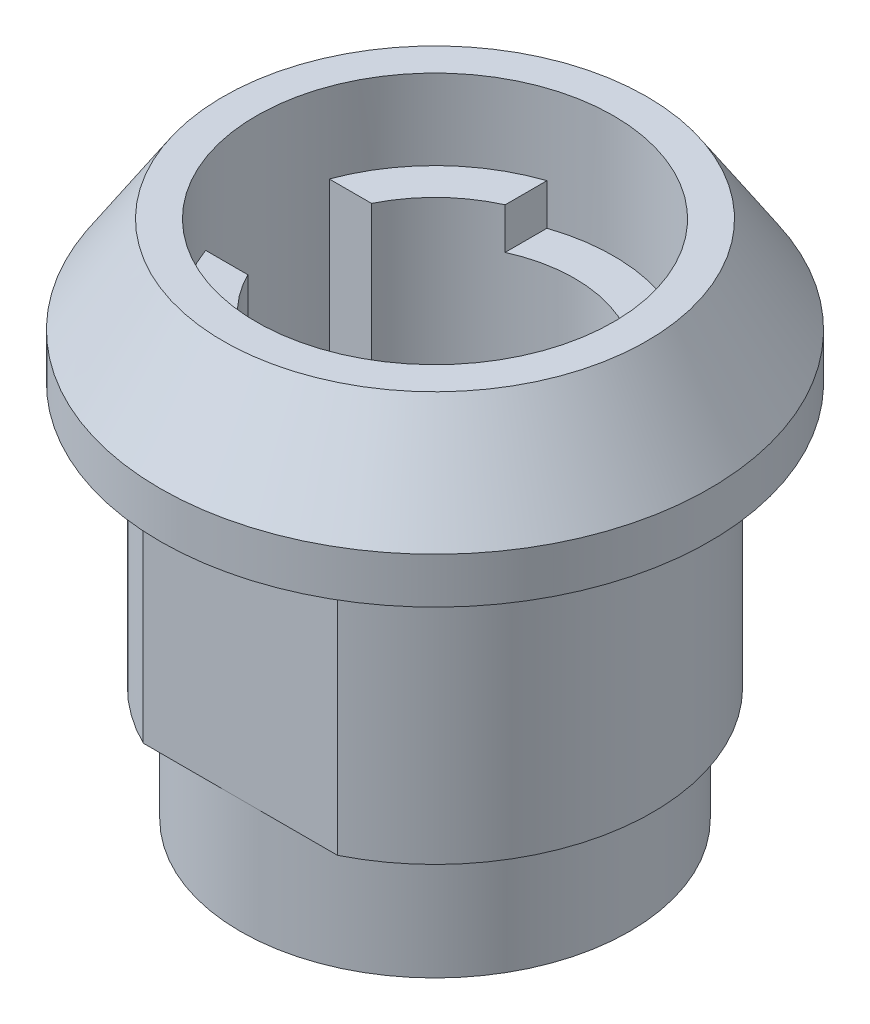
ISO-10303-21;
HEADER;
FILE_DESCRIPTION(('STEP AP214'),'2;1');
FILE_NAME('part.step','',(''),(''),'','','');
FILE_SCHEMA(('AUTOMOTIVE_DESIGN { 1 0 10303 214 1 1 1 1 }'));
ENDSEC;
DATA;
#1=APPLICATION_CONTEXT('core data for automotive mechanical design processes');
#2=APPLICATION_PROTOCOL_DEFINITION('international standard','automotive_design',2000,#1);
#3=PRODUCT_CONTEXT('',#1,'mechanical');
#4=PRODUCT('Part','Part','',(#3));
#5=PRODUCT_RELATED_PRODUCT_CATEGORY('part','',(#4));
#6=PRODUCT_DEFINITION_FORMATION('','',#4);
#7=PRODUCT_DEFINITION_CONTEXT('part definition',#1,'design');
#8=PRODUCT_DEFINITION('design','',#6,#7);
#9=PRODUCT_DEFINITION_SHAPE('','',#8);
#10=(LENGTH_UNIT() NAMED_UNIT(*) SI_UNIT(.MILLI.,.METRE.));
#11=(NAMED_UNIT(*) PLANE_ANGLE_UNIT() SI_UNIT($,.RADIAN.));
#12=(NAMED_UNIT(*) SI_UNIT($,.STERADIAN.) SOLID_ANGLE_UNIT());
#13=UNCERTAINTY_MEASURE_WITH_UNIT(LENGTH_MEASURE(1.E-05),#10,'distance_accuracy_value','');
#14=(GEOMETRIC_REPRESENTATION_CONTEXT(3) GLOBAL_UNCERTAINTY_ASSIGNED_CONTEXT((#13)) GLOBAL_UNIT_ASSIGNED_CONTEXT((#10,
#11,#12)) REPRESENTATION_CONTEXT('',''));
#15=CARTESIAN_POINT('',(0.,0.,0.));
#16=DIRECTION('',(0.,0.,1.));
#17=DIRECTION('',(1.,0.,0.));
#18=AXIS2_PLACEMENT_3D('',#15,#16,#17);
#19=CARTESIAN_POINT('',(0.,8.7,0.));
#20=DIRECTION('',(0.,1.,0.));
#21=DIRECTION('',(0.,0.,1.));
#22=AXIS2_PLACEMENT_3D('',#19,#20,#21);
#23=CYLINDRICAL_SURFACE('',#22,6.1);
#24=CARTESIAN_POINT('',(0.,17.4,0.));
#25=DIRECTION('',(0.,-1.,0.));
#26=DIRECTION('',(0.,0.,1.));
#27=AXIS2_PLACEMENT_3D('',#24,#25,#26);
#28=CIRCLE('',#27,6.1);
#29=CARTESIAN_POINT('',(-2.5,17.4,-5.56417109729742));
#30=VERTEX_POINT('',#29);
#31=CARTESIAN_POINT('',(5.46991773247094,17.4,-2.7));
#32=VERTEX_POINT('',#31);
#33=EDGE_CURVE('E11',#30,#32,#28,.T.);
#34=ORIENTED_EDGE('',*,*,#33,.F.);
#35=DIRECTION('',(0.,1.,0.));
#36=VECTOR('',#35,1.);
#37=CARTESIAN_POINT('',(-2.5,17.4,-5.56417109729743));
#38=LINE('',#37,#36);
#39=CARTESIAN_POINT('',(-2.5,19.2,-5.56417109729743));
#40=VERTEX_POINT('',#39);
#41=EDGE_CURVE('E307',#30,#40,#38,.T.);
#42=ORIENTED_EDGE('',*,*,#41,.T.);
#43=CARTESIAN_POINT('',(0.,19.2,0.));
#44=DIRECTION('',(0.,-1.,0.));
#45=DIRECTION('',(0.,0.,1.));
#46=AXIS2_PLACEMENT_3D('',#43,#44,#45);
#47=CIRCLE('',#46,6.1);
#48=CARTESIAN_POINT('',(-5.46991773247094,19.2,-2.7));
#49=VERTEX_POINT('',#48);
#50=EDGE_CURVE('E295',#49,#40,#47,.T.);
#51=ORIENTED_EDGE('',*,*,#50,.F.);
#52=DIRECTION('',(0.,1.,0.));
#53=VECTOR('',#52,1.);
#54=CARTESIAN_POINT('',(-5.46991773247094,3.8,-2.7));
#55=LINE('',#54,#53);
#56=CARTESIAN_POINT('',(-5.46991773247094,3.8,-2.7));
#57=VERTEX_POINT('',#56);
#58=EDGE_CURVE('E301',#57,#49,#55,.T.);
#59=ORIENTED_EDGE('',*,*,#58,.F.);
#60=CARTESIAN_POINT('',(0.,3.8,0.));
#61=DIRECTION('',(0.,1.,0.));
#62=DIRECTION('',(0.,0.,1.));
#63=AXIS2_PLACEMENT_3D('',#60,#61,#62);
#64=CIRCLE('',#63,6.1);
#65=CARTESIAN_POINT('',(-5.46991773247094,3.8,2.7));
#66=VERTEX_POINT('',#65);
#67=EDGE_CURVE('E261',#57,#66,#64,.T.);
#68=ORIENTED_EDGE('',*,*,#67,.T.);
#69=DIRECTION('',(0.,1.,0.));
#70=VECTOR('',#69,1.);
#71=CARTESIAN_POINT('',(-5.46991773247094,3.8,2.7));
#72=LINE('',#71,#70);
#73=CARTESIAN_POINT('',(-5.46991773247094,19.2,2.7));
#74=VERTEX_POINT('',#73);
#75=EDGE_CURVE('E240',#66,#74,#72,.T.);
#76=ORIENTED_EDGE('',*,*,#75,.T.);
#77=CARTESIAN_POINT('',(0.,19.2,0.));
#78=DIRECTION('',(0.,1.,0.));
#79=DIRECTION('',(0.,0.,1.));
#80=AXIS2_PLACEMENT_3D('',#77,#78,#79);
#81=CIRCLE('',#80,6.1);
#82=CARTESIAN_POINT('',(-2.5,19.2,5.56417109729743));
#83=VERTEX_POINT('',#82);
#84=EDGE_CURVE('E274',#74,#83,#81,.T.);
#85=ORIENTED_EDGE('',*,*,#84,.T.);
#86=DIRECTION('',(0.,1.,0.));
#87=VECTOR('',#86,1.);
#88=CARTESIAN_POINT('',(-2.5,17.4,5.56417109729743));
#89=LINE('',#88,#87);
#90=CARTESIAN_POINT('',(-2.5,17.4,5.56417109729743));
#91=VERTEX_POINT('',#90);
#92=EDGE_CURVE('E272',#91,#83,#89,.T.);
#93=ORIENTED_EDGE('',*,*,#92,.F.);
#94=CARTESIAN_POINT('',(0.,17.4,0.));
#95=DIRECTION('',(0.,-1.,0.));
#96=DIRECTION('',(0.,0.,1.));
#97=AXIS2_PLACEMENT_3D('',#94,#95,#96);
#98=CIRCLE('',#97,6.1);
#99=CARTESIAN_POINT('',(5.46991773247094,17.4,2.7));
#100=VERTEX_POINT('',#99);
#101=EDGE_CURVE('E248',#100,#91,#98,.T.);
#102=ORIENTED_EDGE('',*,*,#101,.F.);
#103=DIRECTION('',(0.,1.,0.));
#104=VECTOR('',#103,1.);
#105=CARTESIAN_POINT('',(5.46991773247094,3.8,2.7));
#106=LINE('',#105,#104);
#107=CARTESIAN_POINT('',(5.46991773247094,3.8,2.7));
#108=VERTEX_POINT('',#107);
#109=EDGE_CURVE('E51',#108,#100,#106,.T.);
#110=ORIENTED_EDGE('',*,*,#109,.F.);
#111=CARTESIAN_POINT('',(0.,3.8,0.));
#112=DIRECTION('',(0.,1.,0.));
#113=DIRECTION('',(0.,0.,1.));
#114=AXIS2_PLACEMENT_3D('',#111,#112,#113);
#115=CIRCLE('',#114,6.1);
#116=CARTESIAN_POINT('',(5.46991773247094,3.8,-2.7));
#117=VERTEX_POINT('',#116);
#118=EDGE_CURVE('E257',#108,#117,#115,.T.);
#119=ORIENTED_EDGE('',*,*,#118,.T.);
#120=DIRECTION('',(0.,1.,0.));
#121=VECTOR('',#120,1.);
#122=CARTESIAN_POINT('',(5.46991773247094,3.8,-2.7));
#123=LINE('',#122,#121);
#124=EDGE_CURVE('E333',#117,#32,#123,.T.);
#125=ORIENTED_EDGE('',*,*,#124,.T.);
#126=EDGE_LOOP('',(#34,#42,#51,#59,#68,#76,#85,#93,#102,#110,#119,#125));
#127=FACE_BOUND('',#126,.T.);
#128=CARTESIAN_POINT('',(0.,0.,0.));
#129=DIRECTION('',(0.,1.,0.));
#130=DIRECTION('',(0.,0.,1.));
#131=AXIS2_PLACEMENT_3D('',#128,#129,#130);
#132=CIRCLE('',#131,6.1);
#133=CARTESIAN_POINT('',(0.,0.,-6.1));
#134=VERTEX_POINT('',#133);
#135=EDGE_CURVE('E293',#134,#134,#132,.T.);
#136=ORIENTED_EDGE('',*,*,#135,.F.);
#137=EDGE_LOOP('',(#136));
#138=FACE_BOUND('',#137,.T.);
#139=ADVANCED_FACE('F41',(#127,#138),#23,.F.);
#140=CARTESIAN_POINT('',(0.,13.25,0.));
#141=DIRECTION('',(0.,1.,0.));
#142=DIRECTION('',(0.,0.,1.));
#143=AXIS2_PLACEMENT_3D('',#140,#141,#142);
#144=CYLINDRICAL_SURFACE('',#143,7.8);
#145=CARTESIAN_POINT('',(0.,22.7,0.));
#146=DIRECTION('',(0.,1.,0.));
#147=DIRECTION('',(0.,0.,1.));
#148=AXIS2_PLACEMENT_3D('',#145,#146,#147);
#149=CIRCLE('',#148,7.8);
#150=CARTESIAN_POINT('',(0.,22.7,-7.8));
#151=VERTEX_POINT('',#150);
#152=EDGE_CURVE('E249',#151,#151,#149,.T.);
#153=ORIENTED_EDGE('',*,*,#152,.T.);
#154=EDGE_LOOP('',(#153));
#155=FACE_BOUND('',#154,.T.);
#156=CARTESIAN_POINT('',(0.,17.4,0.));
#157=DIRECTION('',(0.,1.,0.));
#158=DIRECTION('',(0.,0.,-1.));
#159=AXIS2_PLACEMENT_3D('',#156,#157,#158);
#160=CIRCLE('',#159,7.8);
#161=CARTESIAN_POINT('',(7.31778655059028,17.4,-2.7));
#162=VERTEX_POINT('',#161);
#163=CARTESIAN_POINT('',(-2.5,17.4,-7.38850458482636));
#164=VERTEX_POINT('',#163);
#165=EDGE_CURVE('E296',#162,#164,#160,.T.);
#166=ORIENTED_EDGE('',*,*,#165,.F.);
#167=DIRECTION('',(0.,1.,0.));
#168=VECTOR('',#167,1.);
#169=CARTESIAN_POINT('',(7.31778655059028,3.8,-2.7));
#170=LINE('',#169,#168);
#171=CARTESIAN_POINT('',(7.31778655059028,3.8,-2.7));
#172=VERTEX_POINT('',#171);
#173=EDGE_CURVE('E231',#172,#162,#170,.T.);
#174=ORIENTED_EDGE('',*,*,#173,.F.);
#175=CARTESIAN_POINT('',(0.,3.8,0.));
#176=DIRECTION('',(0.,-1.,0.));
#177=DIRECTION('',(0.,0.,-1.));
#178=AXIS2_PLACEMENT_3D('',#175,#176,#177);
#179=CIRCLE('',#178,7.8);
#180=CARTESIAN_POINT('',(7.31778655059028,3.8,2.7));
#181=VERTEX_POINT('',#180);
#182=EDGE_CURVE('E260',#172,#181,#179,.T.);
#183=ORIENTED_EDGE('',*,*,#182,.T.);
#184=DIRECTION('',(0.,1.,0.));
#185=VECTOR('',#184,1.);
#186=CARTESIAN_POINT('',(7.31778655059028,3.8,2.7));
#187=LINE('',#186,#185);
#188=CARTESIAN_POINT('',(7.31778655059028,17.4,2.7));
#189=VERTEX_POINT('',#188);
#190=EDGE_CURVE('E233',#181,#189,#187,.T.);
#191=ORIENTED_EDGE('',*,*,#190,.T.);
#192=CARTESIAN_POINT('',(0.,17.4,0.));
#193=DIRECTION('',(0.,1.,0.));
#194=DIRECTION('',(0.,0.,-1.));
#195=AXIS2_PLACEMENT_3D('',#192,#193,#194);
#196=CIRCLE('',#195,7.8);
#197=CARTESIAN_POINT('',(-2.5,17.4,7.38850458482635));
#198=VERTEX_POINT('',#197);
#199=EDGE_CURVE('E228',#198,#189,#196,.T.);
#200=ORIENTED_EDGE('',*,*,#199,.F.);
#201=DIRECTION('',(0.,1.,0.));
#202=VECTOR('',#201,1.);
#203=CARTESIAN_POINT('',(-2.5,17.4,7.38850458482635));
#204=LINE('',#203,#202);
#205=CARTESIAN_POINT('',(-2.5,19.2,7.38850458482635));
#206=VERTEX_POINT('',#205);
#207=EDGE_CURVE('E256',#198,#206,#204,.T.);
#208=ORIENTED_EDGE('',*,*,#207,.T.);
#209=CARTESIAN_POINT('',(0.,19.2,0.));
#210=DIRECTION('',(0.,-1.,0.));
#211=DIRECTION('',(0.,0.,-1.));
#212=AXIS2_PLACEMENT_3D('',#209,#210,#211);
#213=CIRCLE('',#212,7.8);
#214=CARTESIAN_POINT('',(-7.31778655059028,19.2,2.7));
#215=VERTEX_POINT('',#214);
#216=EDGE_CURVE('E298',#206,#215,#213,.T.);
#217=ORIENTED_EDGE('',*,*,#216,.T.);
#218=DIRECTION('',(0.,1.,0.));
#219=VECTOR('',#218,1.);
#220=CARTESIAN_POINT('',(-7.31778655059028,3.8,2.7));
#221=LINE('',#220,#219);
#222=CARTESIAN_POINT('',(-7.31778655059028,3.8,2.7));
#223=VERTEX_POINT('',#222);
#224=EDGE_CURVE('E230',#223,#215,#221,.T.);
#225=ORIENTED_EDGE('',*,*,#224,.F.);
#226=CARTESIAN_POINT('',(0.,3.8,0.));
#227=DIRECTION('',(0.,-1.,0.));
#228=DIRECTION('',(0.,0.,-1.));
#229=AXIS2_PLACEMENT_3D('',#226,#227,#228);
#230=CIRCLE('',#229,7.8);
#231=CARTESIAN_POINT('',(-7.31778655059028,3.8,-2.7));
#232=VERTEX_POINT('',#231);
#233=EDGE_CURVE('E282',#223,#232,#230,.T.);
#234=ORIENTED_EDGE('',*,*,#233,.T.);
#235=DIRECTION('',(0.,1.,0.));
#236=VECTOR('',#235,1.);
#237=CARTESIAN_POINT('',(-7.31778655059028,3.8,-2.7));
#238=LINE('',#237,#236);
#239=CARTESIAN_POINT('',(-7.31778655059028,19.2,-2.7));
#240=VERTEX_POINT('',#239);
#241=EDGE_CURVE('E265',#232,#240,#238,.T.);
#242=ORIENTED_EDGE('',*,*,#241,.T.);
#243=CARTESIAN_POINT('',(0.,19.2,0.));
#244=DIRECTION('',(0.,1.,0.));
#245=DIRECTION('',(0.,0.,-1.));
#246=AXIS2_PLACEMENT_3D('',#243,#244,#245);
#247=CIRCLE('',#246,7.8);
#248=CARTESIAN_POINT('',(-2.5,19.2,-7.38850458482636));
#249=VERTEX_POINT('',#248);
#250=EDGE_CURVE('E279',#249,#240,#247,.T.);
#251=ORIENTED_EDGE('',*,*,#250,.F.);
#252=DIRECTION('',(0.,1.,0.));
#253=VECTOR('',#252,1.);
#254=CARTESIAN_POINT('',(-2.5,17.4,-7.38850458482636));
#255=LINE('',#254,#253);
#256=EDGE_CURVE('E225',#164,#249,#255,.T.);
#257=ORIENTED_EDGE('',*,*,#256,.F.);
#258=EDGE_LOOP('',(#166,#174,#183,#191,#200,#208,#217,#225,#234,#242,#251,#257));
#259=FACE_BOUND('',#258,.T.);
#260=ADVANCED_FACE('F345',(#155,#259),#144,.F.);
#261=CARTESIAN_POINT('',(0.,22.7,0.));
#262=DIRECTION('',(0.,-1.,0.));
#263=DIRECTION('',(0.,0.,1.));
#264=AXIS2_PLACEMENT_3D('',#261,#262,#263);
#265=CONICAL_SURFACE('',#264,9.25,0.579715500445564);
#266=CARTESIAN_POINT('',(0.,22.7,0.));
#267=DIRECTION('',(0.,1.,0.));
#268=DIRECTION('',(0.,0.,1.));
#269=AXIS2_PLACEMENT_3D('',#266,#267,#268);
#270=CIRCLE('',#269,9.25);
#271=CARTESIAN_POINT('',(0.,22.7,-9.25));
#272=VERTEX_POINT('',#271);
#273=EDGE_CURVE('E221',#272,#272,#270,.T.);
#274=ORIENTED_EDGE('',*,*,#273,.F.);
#275=EDGE_LOOP('',(#274));
#276=FACE_BOUND('',#275,.T.);
#277=CARTESIAN_POINT('',(0.,18.5,0.));
#278=DIRECTION('',(0.,1.,0.));
#279=DIRECTION('',(0.,0.,1.));
#280=AXIS2_PLACEMENT_3D('',#277,#278,#279);
#281=CIRCLE('',#280,12.);
#282=CARTESIAN_POINT('',(0.,18.5,-12.));
#283=VERTEX_POINT('',#282);
#284=EDGE_CURVE('E219',#283,#283,#281,.T.);
#285=ORIENTED_EDGE('',*,*,#284,.T.);
#286=EDGE_LOOP('',(#285));
#287=FACE_BOUND('',#286,.T.);
#288=ADVANCED_FACE('F438',(#276,#287),#265,.T.);
#289=CARTESIAN_POINT('',(0.,0.,0.));
#290=DIRECTION('',(0.,1.,0.));
#291=DIRECTION('',(0.,0.,1.));
#292=AXIS2_PLACEMENT_3D('',#289,#290,#291);
#293=CYLINDRICAL_SURFACE('',#292,12.);
#294=CARTESIAN_POINT('',(0.,16.5,0.));
#295=DIRECTION('',(0.,1.,0.));
#296=DIRECTION('',(0.,0.,1.));
#297=AXIS2_PLACEMENT_3D('',#294,#295,#296);
#298=CIRCLE('',#297,12.);
#299=CARTESIAN_POINT('',(0.,16.5,-12.));
#300=VERTEX_POINT('',#299);
#301=EDGE_CURVE('E174',#300,#300,#298,.T.);
#302=ORIENTED_EDGE('',*,*,#301,.T.);
#303=EDGE_LOOP('',(#302));
#304=FACE_BOUND('',#303,.T.);
#305=ORIENTED_EDGE('',*,*,#284,.F.);
#306=EDGE_LOOP('',(#305));
#307=FACE_BOUND('',#306,.T.);
#308=ADVANCED_FACE('F441',(#304,#307),#293,.T.);
#309=CARTESIAN_POINT('',(0.,0.,0.));
#310=DIRECTION('',(0.,1.,0.));
#311=DIRECTION('',(0.,0.,1.));
#312=AXIS2_PLACEMENT_3D('',#309,#310,#311);
#313=CYLINDRICAL_SURFACE('',#312,8.5);
#314=CARTESIAN_POINT('',(0.,0.,0.));
#315=DIRECTION('',(0.,1.,0.));
#316=DIRECTION('',(0.,0.,1.));
#317=AXIS2_PLACEMENT_3D('',#314,#315,#316);
#318=CIRCLE('',#317,8.5);
#319=CARTESIAN_POINT('',(0.,0.,-8.5));
#320=VERTEX_POINT('',#319);
#321=EDGE_CURVE('E178',#320,#320,#318,.T.);
#322=ORIENTED_EDGE('',*,*,#321,.T.);
#323=EDGE_LOOP('',(#322));
#324=FACE_BOUND('',#323,.T.);
#325=CARTESIAN_POINT('',(0.,5.,0.));
#326=DIRECTION('',(0.,1.,0.));
#327=DIRECTION('',(0.,0.,1.));
#328=AXIS2_PLACEMENT_3D('',#325,#326,#327);
#329=CIRCLE('',#328,8.5);
#330=CARTESIAN_POINT('',(0.,5.,-8.5));
#331=VERTEX_POINT('',#330);
#332=CARTESIAN_POINT('',(0.,5.,8.5));
#333=VERTEX_POINT('',#332);
#334=EDGE_CURVE('E215',#331,#333,#329,.T.);
#335=ORIENTED_EDGE('',*,*,#334,.F.);
#336=CARTESIAN_POINT('',(0.,5.,0.));
#337=DIRECTION('',(0.,1.,0.));
#338=DIRECTION('',(0.,0.,1.));
#339=AXIS2_PLACEMENT_3D('',#336,#337,#338);
#340=CIRCLE('',#339,8.5);
#341=EDGE_CURVE('E205',#333,#331,#340,.T.);
#342=ORIENTED_EDGE('',*,*,#341,.F.);
#343=EDGE_LOOP('',(#335,#342));
#344=FACE_BOUND('',#343,.T.);
#345=ADVANCED_FACE('F214',(#324,#344),#313,.T.);
#346=CARTESIAN_POINT('',(0.,5.,0.));
#347=DIRECTION('',(0.,1.,0.));
#348=DIRECTION('',(-1.,0.,0.));
#349=AXIS2_PLACEMENT_3D('',#346,#347,#348);
#350=CYLINDRICAL_SURFACE('',#349,9.5);
#351=DIRECTION('',(0.,1.,0.));
#352=VECTOR('',#351,1.);
#353=CARTESIAN_POINT('',(-4.24264068711929,5.,8.5));
#354=LINE('',#353,#352);
#355=CARTESIAN_POINT('',(-4.24264068711929,5.,8.5));
#356=VERTEX_POINT('',#355);
#357=CARTESIAN_POINT('',(-4.24264068711929,16.5,8.5));
#358=VERTEX_POINT('',#357);
#359=EDGE_CURVE('E192',#356,#358,#354,.T.);
#360=ORIENTED_EDGE('',*,*,#359,.T.);
#361=CARTESIAN_POINT('',(0.,16.5,0.));
#362=DIRECTION('',(0.,-1.,0.));
#363=DIRECTION('',(-1.,0.,0.));
#364=AXIS2_PLACEMENT_3D('',#361,#362,#363);
#365=CIRCLE('',#364,9.5);
#366=CARTESIAN_POINT('',(-4.24264068711929,16.5,-8.5));
#367=VERTEX_POINT('',#366);
#368=EDGE_CURVE('E289',#358,#367,#365,.T.);
#369=ORIENTED_EDGE('',*,*,#368,.T.);
#370=DIRECTION('',(0.,-1.,0.));
#371=VECTOR('',#370,1.);
#372=CARTESIAN_POINT('',(-4.24264068711929,16.5,-8.5));
#373=LINE('',#372,#371);
#374=CARTESIAN_POINT('',(-4.24264068711929,5.,-8.5));
#375=VERTEX_POINT('',#374);
#376=EDGE_CURVE('E269',#367,#375,#373,.T.);
#377=ORIENTED_EDGE('',*,*,#376,.T.);
#378=CARTESIAN_POINT('',(0.,5.,0.));
#379=DIRECTION('',(0.,1.,0.));
#380=DIRECTION('',(-1.,0.,0.));
#381=AXIS2_PLACEMENT_3D('',#378,#379,#380);
#382=CIRCLE('',#381,9.5);
#383=EDGE_CURVE('E197',#375,#356,#382,.T.);
#384=ORIENTED_EDGE('',*,*,#383,.T.);
#385=EDGE_LOOP('',(#360,#369,#377,#384));
#386=FACE_BOUND('',#385,.T.);
#387=ADVANCED_FACE('F382',(#386),#350,.T.);
#388=CARTESIAN_POINT('',(0.,5.,0.));
#389=DIRECTION('',(0.,1.,0.));
#390=DIRECTION('',(1.,0.,0.));
#391=AXIS2_PLACEMENT_3D('',#388,#389,#390);
#392=CYLINDRICAL_SURFACE('',#391,9.5);
#393=DIRECTION('',(0.,-1.,0.));
#394=VECTOR('',#393,1.);
#395=CARTESIAN_POINT('',(4.24264068711929,16.5,8.5));
#396=LINE('',#395,#394);
#397=CARTESIAN_POINT('',(4.24264068711929,16.5,8.5));
#398=VERTEX_POINT('',#397);
#399=CARTESIAN_POINT('',(4.24264068711929,5.,8.5));
#400=VERTEX_POINT('',#399);
#401=EDGE_CURVE('E263',#398,#400,#396,.T.);
#402=ORIENTED_EDGE('',*,*,#401,.T.);
#403=CARTESIAN_POINT('',(0.,5.,0.));
#404=DIRECTION('',(0.,1.,0.));
#405=DIRECTION('',(-1.,0.,0.));
#406=AXIS2_PLACEMENT_3D('',#403,#404,#405);
#407=CIRCLE('',#406,9.5);
#408=CARTESIAN_POINT('',(4.24264068711929,5.,-8.5));
#409=VERTEX_POINT('',#408);
#410=EDGE_CURVE('E208',#400,#409,#407,.T.);
#411=ORIENTED_EDGE('',*,*,#410,.T.);
#412=DIRECTION('',(0.,1.,0.));
#413=VECTOR('',#412,1.);
#414=CARTESIAN_POINT('',(4.24264068711929,5.,-8.5));
#415=LINE('',#414,#413);
#416=CARTESIAN_POINT('',(4.24264068711929,16.5,-8.5));
#417=VERTEX_POINT('',#416);
#418=EDGE_CURVE('E211',#409,#417,#415,.T.);
#419=ORIENTED_EDGE('',*,*,#418,.T.);
#420=CARTESIAN_POINT('',(0.,16.5,0.));
#421=DIRECTION('',(0.,-1.,0.));
#422=DIRECTION('',(-1.,0.,0.));
#423=AXIS2_PLACEMENT_3D('',#420,#421,#422);
#424=CIRCLE('',#423,9.5);
#425=EDGE_CURVE('E252',#417,#398,#424,.T.);
#426=ORIENTED_EDGE('',*,*,#425,.T.);
#427=EDGE_LOOP('',(#402,#411,#419,#426));
#428=FACE_BOUND('',#427,.T.);
#429=ADVANCED_FACE('F380',(#428),#392,.T.);
#430=CARTESIAN_POINT('',(-10.,5.,0.));
#431=DIRECTION('',(0.,-1.,0.));
#432=DIRECTION('',(0.,0.,1.));
#433=AXIS2_PLACEMENT_3D('',#430,#431,#432);
#434=PLANE('',#433);
#435=ORIENTED_EDGE('',*,*,#410,.F.);
#436=DIRECTION('',(1.,0.,0.));
#437=VECTOR('',#436,1.);
#438=CARTESIAN_POINT('',(0.,5.,8.5));
#439=LINE('',#438,#437);
#440=EDGE_CURVE('E189',#333,#400,#439,.T.);
#441=ORIENTED_EDGE('',*,*,#440,.F.);
#442=ORIENTED_EDGE('',*,*,#341,.T.);
#443=DIRECTION('',(-1.,0.,0.));
#444=VECTOR('',#443,1.);
#445=CARTESIAN_POINT('',(4.24264068711928,5.,-8.5));
#446=LINE('',#445,#444);
#447=EDGE_CURVE('E210',#409,#331,#446,.T.);
#448=ORIENTED_EDGE('',*,*,#447,.F.);
#449=EDGE_LOOP('',(#435,#441,#442,#448));
#450=FACE_BOUND('',#449,.T.);
#451=ADVANCED_FACE('F203',(#450),#434,.T.);
#452=CARTESIAN_POINT('',(-11.,16.5,-8.5));
#453=DIRECTION('',(0.,0.,-1.));
#454=DIRECTION('',(1.,0.,0.));
#455=AXIS2_PLACEMENT_3D('',#452,#453,#454);
#456=PLANE('',#455);
#457=ORIENTED_EDGE('',*,*,#418,.F.);
#458=ORIENTED_EDGE('',*,*,#447,.T.);
#459=DIRECTION('',(-1.,0.,0.));
#460=VECTOR('',#459,1.);
#461=CARTESIAN_POINT('',(0.,5.,-8.5));
#462=LINE('',#461,#460);
#463=EDGE_CURVE('E198',#331,#375,#462,.T.);
#464=ORIENTED_EDGE('',*,*,#463,.T.);
#465=ORIENTED_EDGE('',*,*,#376,.F.);
#466=DIRECTION('',(1.,0.,0.));
#467=VECTOR('',#466,1.);
#468=CARTESIAN_POINT('',(-4.24264068711928,16.5,-8.5));
#469=LINE('',#468,#467);
#470=EDGE_CURVE('E255',#367,#417,#469,.T.);
#471=ORIENTED_EDGE('',*,*,#470,.T.);
#472=EDGE_LOOP('',(#457,#458,#464,#465,#471));
#473=FACE_BOUND('',#472,.T.);
#474=ADVANCED_FACE('F388',(#473),#456,.T.);
#475=CARTESIAN_POINT('',(-10.,5.,0.));
#476=DIRECTION('',(0.,-1.,0.));
#477=DIRECTION('',(0.,0.,1.));
#478=AXIS2_PLACEMENT_3D('',#475,#476,#477);
#479=PLANE('',#478);
#480=ORIENTED_EDGE('',*,*,#383,.F.);
#481=ORIENTED_EDGE('',*,*,#463,.F.);
#482=ORIENTED_EDGE('',*,*,#334,.T.);
#483=DIRECTION('',(1.,0.,0.));
#484=VECTOR('',#483,1.);
#485=CARTESIAN_POINT('',(-4.24264068711928,5.,8.5));
#486=LINE('',#485,#484);
#487=EDGE_CURVE('E184',#356,#333,#486,.T.);
#488=ORIENTED_EDGE('',*,*,#487,.F.);
#489=EDGE_LOOP('',(#480,#481,#482,#488));
#490=FACE_BOUND('',#489,.T.);
#491=ADVANCED_FACE('F217',(#490),#479,.T.);
#492=CARTESIAN_POINT('',(-7.5,22.7,0.));
#493=DIRECTION('',(0.,1.,0.));
#494=DIRECTION('',(1.,0.,0.));
#495=AXIS2_PLACEMENT_3D('',#492,#493,#494);
#496=PLANE('',#495);
#497=ORIENTED_EDGE('',*,*,#273,.T.);
#498=EDGE_LOOP('',(#497));
#499=FACE_BOUND('',#498,.T.);
#500=ORIENTED_EDGE('',*,*,#152,.F.);
#501=EDGE_LOOP('',(#500));
#502=FACE_BOUND('',#501,.T.);
#503=ADVANCED_FACE('F371',(#499,#502),#496,.T.);
#504=CARTESIAN_POINT('',(0.,17.4,0.));
#505=DIRECTION('',(0.,1.,0.));
#506=DIRECTION('',(1.,0.,0.));
#507=AXIS2_PLACEMENT_3D('',#504,#505,#506);
#508=PLANE('',#507);
#509=ORIENTED_EDGE('',*,*,#199,.T.);
#510=DIRECTION('',(-1.,0.,0.));
#511=VECTOR('',#510,1.);
#512=CARTESIAN_POINT('',(7.31778655059028,17.4,2.7));
#513=LINE('',#512,#511);
#514=EDGE_CURVE('E232',#189,#100,#513,.T.);
#515=ORIENTED_EDGE('',*,*,#514,.T.);
#516=ORIENTED_EDGE('',*,*,#101,.T.);
#517=DIRECTION('',(0.,0.,-1.));
#518=VECTOR('',#517,1.);
#519=CARTESIAN_POINT('',(-2.5,17.4,7.38850458482635));
#520=LINE('',#519,#518);
#521=EDGE_CURVE('E251',#198,#91,#520,.T.);
#522=ORIENTED_EDGE('',*,*,#521,.F.);
#523=EDGE_LOOP('',(#509,#515,#516,#522));
#524=FACE_BOUND('',#523,.T.);
#525=ADVANCED_FACE('F362',(#524),#508,.T.);
#526=CARTESIAN_POINT('',(-8.5,0.,0.));
#527=DIRECTION('',(0.,-1.,0.));
#528=DIRECTION('',(0.,0.,1.));
#529=AXIS2_PLACEMENT_3D('',#526,#527,#528);
#530=PLANE('',#529);
#531=ORIENTED_EDGE('',*,*,#321,.F.);
#532=EDGE_LOOP('',(#531));
#533=FACE_BOUND('',#532,.T.);
#534=ORIENTED_EDGE('',*,*,#135,.T.);
#535=EDGE_LOOP('',(#534));
#536=FACE_BOUND('',#535,.T.);
#537=ADVANCED_FACE('F360',(#533,#536),#530,.T.);
#538=CARTESIAN_POINT('',(11.,16.5,8.5));
#539=DIRECTION('',(0.,0.,1.));
#540=DIRECTION('',(0.,-1.,0.));
#541=AXIS2_PLACEMENT_3D('',#538,#539,#540);
#542=PLANE('',#541);
#543=ORIENTED_EDGE('',*,*,#401,.F.);
#544=DIRECTION('',(-1.,0.,0.));
#545=VECTOR('',#544,1.);
#546=CARTESIAN_POINT('',(4.24264068711928,16.5,8.5));
#547=LINE('',#546,#545);
#548=EDGE_CURVE('E287',#398,#358,#547,.T.);
#549=ORIENTED_EDGE('',*,*,#548,.T.);
#550=ORIENTED_EDGE('',*,*,#359,.F.);
#551=ORIENTED_EDGE('',*,*,#487,.T.);
#552=ORIENTED_EDGE('',*,*,#440,.T.);
#553=EDGE_LOOP('',(#543,#549,#550,#551,#552));
#554=FACE_BOUND('',#553,.T.);
#555=ADVANCED_FACE('F187',(#554),#542,.T.);
#556=CARTESIAN_POINT('',(-12.,16.5,0.));
#557=DIRECTION('',(0.,-1.,0.));
#558=DIRECTION('',(0.,0.,1.));
#559=AXIS2_PLACEMENT_3D('',#556,#557,#558);
#560=PLANE('',#559);
#561=ORIENTED_EDGE('',*,*,#301,.F.);
#562=EDGE_LOOP('',(#561));
#563=FACE_BOUND('',#562,.T.);
#564=ORIENTED_EDGE('',*,*,#548,.F.);
#565=ORIENTED_EDGE('',*,*,#425,.F.);
#566=ORIENTED_EDGE('',*,*,#470,.F.);
#567=ORIENTED_EDGE('',*,*,#368,.F.);
#568=EDGE_LOOP('',(#564,#565,#566,#567));
#569=FACE_BOUND('',#568,.T.);
#570=ADVANCED_FACE('F369',(#563,#569),#560,.T.);
#571=CARTESIAN_POINT('',(-2.5,-62.4649251514995,5.56417109729743));
#572=DIRECTION('',(1.,0.,0.));
#573=DIRECTION('',(0.,1.,0.));
#574=AXIS2_PLACEMENT_3D('',#571,#572,#573);
#575=PLANE('',#574);
#576=ORIENTED_EDGE('',*,*,#521,.T.);
#577=ORIENTED_EDGE('',*,*,#92,.T.);
#578=DIRECTION('',(0.,0.,1.));
#579=VECTOR('',#578,1.);
#580=CARTESIAN_POINT('',(-2.5,19.2,5.56417109729743));
#581=LINE('',#580,#579);
#582=EDGE_CURVE('E292',#83,#206,#581,.T.);
#583=ORIENTED_EDGE('',*,*,#582,.T.);
#584=ORIENTED_EDGE('',*,*,#207,.F.);
#585=EDGE_LOOP('',(#576,#577,#583,#584));
#586=FACE_BOUND('',#585,.T.);
#587=ADVANCED_FACE('F375',(#586),#575,.T.);
#588=CARTESIAN_POINT('',(0.,19.2,0.));
#589=DIRECTION('',(0.,1.,0.));
#590=DIRECTION('',(1.,0.,0.));
#591=AXIS2_PLACEMENT_3D('',#588,#589,#590);
#592=PLANE('',#591);
#593=ORIENTED_EDGE('',*,*,#582,.F.);
#594=ORIENTED_EDGE('',*,*,#84,.F.);
#595=DIRECTION('',(1.,0.,0.));
#596=VECTOR('',#595,1.);
#597=CARTESIAN_POINT('',(-7.31778655059028,19.2,2.7));
#598=LINE('',#597,#596);
#599=EDGE_CURVE('E277',#215,#74,#598,.T.);
#600=ORIENTED_EDGE('',*,*,#599,.F.);
#601=ORIENTED_EDGE('',*,*,#216,.F.);
#602=EDGE_LOOP('',(#593,#594,#600,#601));
#603=FACE_BOUND('',#602,.T.);
#604=ADVANCED_FACE('F414',(#603),#592,.T.);
#605=CARTESIAN_POINT('',(0.,3.8,0.));
#606=DIRECTION('',(0.,1.,0.));
#607=DIRECTION('',(1.,0.,0.));
#608=AXIS2_PLACEMENT_3D('',#605,#606,#607);
#609=PLANE('',#608);
#610=DIRECTION('',(-1.,0.,0.));
#611=VECTOR('',#610,1.);
#612=CARTESIAN_POINT('',(7.31778655059028,3.8,-2.7));
#613=LINE('',#612,#611);
#614=EDGE_CURVE('E45',#172,#117,#613,.T.);
#615=ORIENTED_EDGE('',*,*,#614,.T.);
#616=ORIENTED_EDGE('',*,*,#118,.F.);
#617=DIRECTION('',(1.,0.,0.));
#618=VECTOR('',#617,1.);
#619=CARTESIAN_POINT('',(5.46991773247094,3.8,2.7));
#620=LINE('',#619,#618);
#621=EDGE_CURVE('E238',#108,#181,#620,.T.);
#622=ORIENTED_EDGE('',*,*,#621,.T.);
#623=ORIENTED_EDGE('',*,*,#182,.F.);
#624=EDGE_LOOP('',(#615,#616,#622,#623));
#625=FACE_BOUND('',#624,.T.);
#626=ADVANCED_FACE('F401',(#625),#609,.T.);
#627=CARTESIAN_POINT('',(0.,3.8,0.));
#628=DIRECTION('',(0.,1.,0.));
#629=DIRECTION('',(1.,0.,0.));
#630=AXIS2_PLACEMENT_3D('',#627,#628,#629);
#631=PLANE('',#630);
#632=DIRECTION('',(-1.,0.,0.));
#633=VECTOR('',#632,1.);
#634=CARTESIAN_POINT('',(-5.46991773247094,3.8,-2.7));
#635=LINE('',#634,#633);
#636=EDGE_CURVE('E85',#57,#232,#635,.T.);
#637=ORIENTED_EDGE('',*,*,#636,.T.);
#638=ORIENTED_EDGE('',*,*,#233,.F.);
#639=DIRECTION('',(1.,0.,0.));
#640=VECTOR('',#639,1.);
#641=CARTESIAN_POINT('',(-7.31778655059028,3.8,2.7));
#642=LINE('',#641,#640);
#643=EDGE_CURVE('E97',#223,#66,#642,.T.);
#644=ORIENTED_EDGE('',*,*,#643,.T.);
#645=ORIENTED_EDGE('',*,*,#67,.F.);
#646=EDGE_LOOP('',(#637,#638,#644,#645));
#647=FACE_BOUND('',#646,.T.);
#648=ADVANCED_FACE('F416',(#647),#631,.T.);
#649=CARTESIAN_POINT('',(7.31778655059028,-64.2649251514995,2.7));
#650=DIRECTION('',(0.,0.,-1.));
#651=DIRECTION('',(1.,0.,0.));
#652=AXIS2_PLACEMENT_3D('',#649,#650,#651);
#653=PLANE('',#652);
#654=ORIENTED_EDGE('',*,*,#109,.T.);
#655=ORIENTED_EDGE('',*,*,#514,.F.);
#656=ORIENTED_EDGE('',*,*,#190,.F.);
#657=ORIENTED_EDGE('',*,*,#621,.F.);
#658=EDGE_LOOP('',(#654,#655,#656,#657));
#659=FACE_BOUND('',#658,.T.);
#660=ADVANCED_FACE('F43',(#659),#653,.T.);
#661=CARTESIAN_POINT('',(-5.46991773247094,-64.2649251514995,2.7));
#662=DIRECTION('',(0.,0.,-1.));
#663=DIRECTION('',(1.,0.,0.));
#664=AXIS2_PLACEMENT_3D('',#661,#662,#663);
#665=PLANE('',#664);
#666=ORIENTED_EDGE('',*,*,#224,.T.);
#667=ORIENTED_EDGE('',*,*,#599,.T.);
#668=ORIENTED_EDGE('',*,*,#75,.F.);
#669=ORIENTED_EDGE('',*,*,#643,.F.);
#670=EDGE_LOOP('',(#666,#667,#668,#669));
#671=FACE_BOUND('',#670,.T.);
#672=ADVANCED_FACE('F415',(#671),#665,.T.);
#673=CARTESIAN_POINT('',(-7.31778655059028,-64.2649251514995,-2.7));
#674=DIRECTION('',(0.,0.,1.));
#675=DIRECTION('',(0.,-1.,0.));
#676=AXIS2_PLACEMENT_3D('',#673,#674,#675);
#677=PLANE('',#676);
#678=ORIENTED_EDGE('',*,*,#58,.T.);
#679=DIRECTION('',(1.,0.,0.));
#680=VECTOR('',#679,1.);
#681=CARTESIAN_POINT('',(-7.31778655059028,19.2,-2.7));
#682=LINE('',#681,#680);
#683=EDGE_CURVE('E267',#240,#49,#682,.T.);
#684=ORIENTED_EDGE('',*,*,#683,.F.);
#685=ORIENTED_EDGE('',*,*,#241,.F.);
#686=ORIENTED_EDGE('',*,*,#636,.F.);
#687=EDGE_LOOP('',(#678,#684,#685,#686));
#688=FACE_BOUND('',#687,.T.);
#689=ADVANCED_FACE('F427',(#688),#677,.T.);
#690=CARTESIAN_POINT('',(0.,19.2,0.));
#691=DIRECTION('',(0.,1.,0.));
#692=DIRECTION('',(1.,0.,0.));
#693=AXIS2_PLACEMENT_3D('',#690,#691,#692);
#694=PLANE('',#693);
#695=ORIENTED_EDGE('',*,*,#683,.T.);
#696=ORIENTED_EDGE('',*,*,#50,.T.);
#697=DIRECTION('',(0.,0.,-1.));
#698=VECTOR('',#697,1.);
#699=CARTESIAN_POINT('',(-2.5,19.2,-5.56417109729743));
#700=LINE('',#699,#698);
#701=EDGE_CURVE('E304',#40,#249,#700,.T.);
#702=ORIENTED_EDGE('',*,*,#701,.T.);
#703=ORIENTED_EDGE('',*,*,#250,.T.);
#704=EDGE_LOOP('',(#695,#696,#702,#703));
#705=FACE_BOUND('',#704,.T.);
#706=ADVANCED_FACE('F352',(#705),#694,.T.);
#707=CARTESIAN_POINT('',(-2.5,-62.4649251514995,-5.56417109729743));
#708=DIRECTION('',(1.,0.,0.));
#709=DIRECTION('',(0.,1.,0.));
#710=AXIS2_PLACEMENT_3D('',#707,#708,#709);
#711=PLANE('',#710);
#712=DIRECTION('',(0.,0.,-1.));
#713=VECTOR('',#712,1.);
#714=CARTESIAN_POINT('',(-2.5,17.4,-5.56417109729742));
#715=LINE('',#714,#713);
#716=EDGE_CURVE('E283',#30,#164,#715,.T.);
#717=ORIENTED_EDGE('',*,*,#716,.T.);
#718=ORIENTED_EDGE('',*,*,#256,.T.);
#719=ORIENTED_EDGE('',*,*,#701,.F.);
#720=ORIENTED_EDGE('',*,*,#41,.F.);
#721=EDGE_LOOP('',(#717,#718,#719,#720));
#722=FACE_BOUND('',#721,.T.);
#723=ADVANCED_FACE('F349',(#722),#711,.T.);
#724=CARTESIAN_POINT('',(5.46991773247094,-64.2649251514995,-2.7));
#725=DIRECTION('',(0.,0.,1.));
#726=DIRECTION('',(0.,-1.,0.));
#727=AXIS2_PLACEMENT_3D('',#724,#725,#726);
#728=PLANE('',#727);
#729=ORIENTED_EDGE('',*,*,#173,.T.);
#730=DIRECTION('',(1.,0.,0.));
#731=VECTOR('',#730,1.);
#732=CARTESIAN_POINT('',(5.46991773247094,17.4,-2.7));
#733=LINE('',#732,#731);
#734=EDGE_CURVE('E60',#32,#162,#733,.T.);
#735=ORIENTED_EDGE('',*,*,#734,.F.);
#736=ORIENTED_EDGE('',*,*,#124,.F.);
#737=ORIENTED_EDGE('',*,*,#614,.F.);
#738=EDGE_LOOP('',(#729,#735,#736,#737));
#739=FACE_BOUND('',#738,.T.);
#740=ADVANCED_FACE('F340',(#739),#728,.T.);
#741=CARTESIAN_POINT('',(0.,17.4,0.));
#742=DIRECTION('',(0.,1.,0.));
#743=DIRECTION('',(1.,0.,0.));
#744=AXIS2_PLACEMENT_3D('',#741,#742,#743);
#745=PLANE('',#744);
#746=ORIENTED_EDGE('',*,*,#33,.T.);
#747=ORIENTED_EDGE('',*,*,#734,.T.);
#748=ORIENTED_EDGE('',*,*,#165,.T.);
#749=ORIENTED_EDGE('',*,*,#716,.F.);
#750=EDGE_LOOP('',(#746,#747,#748,#749));
#751=FACE_BOUND('',#750,.T.);
#752=ADVANCED_FACE('F337',(#751),#745,.T.);
#753=CLOSED_SHELL('',(#139,#260,#288,#308,#345,#387,#429,#451,#474,#491,#503,#525,#537,#555,
#570,#587,#604,#626,#648,#660,#672,#689,#706,#723,#740,#752));
#754=MANIFOLD_SOLID_BREP('B2',#753);
#755=ADVANCED_BREP_SHAPE_REPRESENTATION('',(#18,#754),#14);
#756=SHAPE_DEFINITION_REPRESENTATION(#9,#755);
ENDSEC;
END-ISO-10303-21;
